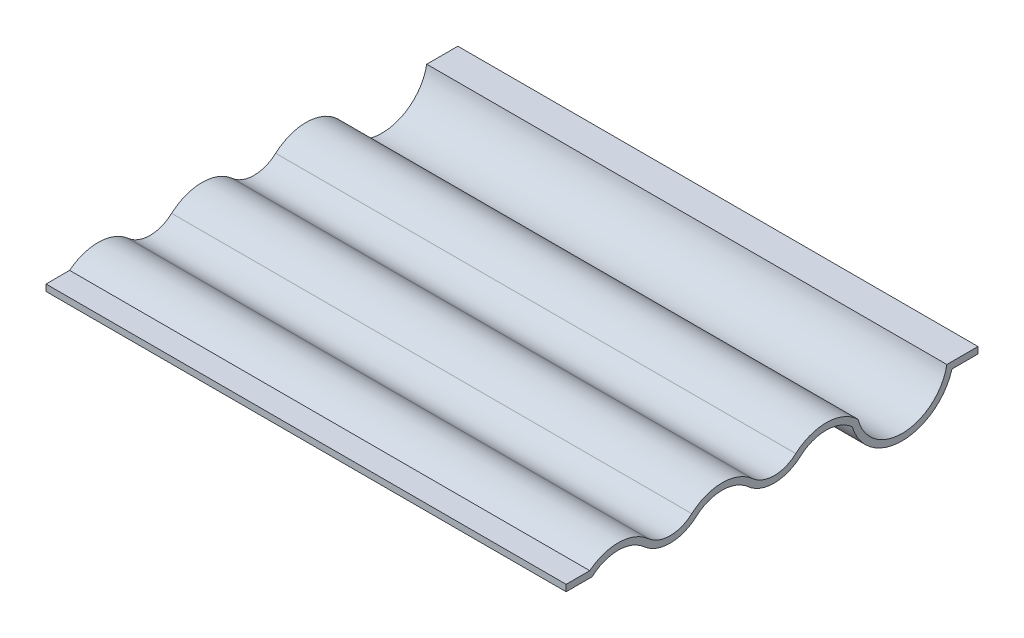
ISO-10303-21;
HEADER;
FILE_DESCRIPTION(('STEP AP214'),'2;1');
FILE_NAME('part.step','',(''),(''),'','','');
FILE_SCHEMA(('AUTOMOTIVE_DESIGN { 1 0 10303 214 1 1 1 1 }'));
ENDSEC;
DATA;
#1=APPLICATION_CONTEXT('core data for automotive mechanical design processes');
#2=APPLICATION_PROTOCOL_DEFINITION('international standard','automotive_design',2000,#1);
#3=PRODUCT_CONTEXT('',#1,'mechanical');
#4=PRODUCT('Part','Part','',(#3));
#5=PRODUCT_RELATED_PRODUCT_CATEGORY('part','',(#4));
#6=PRODUCT_DEFINITION_FORMATION('','',#4);
#7=PRODUCT_DEFINITION_CONTEXT('part definition',#1,'design');
#8=PRODUCT_DEFINITION('design','',#6,#7);
#9=PRODUCT_DEFINITION_SHAPE('','',#8);
#10=(LENGTH_UNIT() NAMED_UNIT(*) SI_UNIT(.MILLI.,.METRE.));
#11=(NAMED_UNIT(*) PLANE_ANGLE_UNIT() SI_UNIT($,.RADIAN.));
#12=(NAMED_UNIT(*) SI_UNIT($,.STERADIAN.) SOLID_ANGLE_UNIT());
#13=UNCERTAINTY_MEASURE_WITH_UNIT(LENGTH_MEASURE(1.E-05),#10,'distance_accuracy_value','');
#14=(GEOMETRIC_REPRESENTATION_CONTEXT(3) GLOBAL_UNCERTAINTY_ASSIGNED_CONTEXT((#13)) GLOBAL_UNIT_ASSIGNED_CONTEXT((#10,
#11,#12)) REPRESENTATION_CONTEXT('',''));
#15=CARTESIAN_POINT('',(0.,0.,0.));
#16=DIRECTION('',(0.,0.,1.));
#17=DIRECTION('',(1.,0.,0.));
#18=AXIS2_PLACEMENT_3D('',#15,#16,#17);
#19=CARTESIAN_POINT('',(254.,-14.1990316571236,64.1799405823263));
#20=DIRECTION('',(-1.,0.,0.));
#21=DIRECTION('',(0.,0.,1.));
#22=AXIS2_PLACEMENT_3D('',#19,#20,#21);
#23=CYLINDRICAL_SURFACE('',#22,19.05);
#24=CARTESIAN_POINT('',(0.,-14.1990316571236,64.1799405823263));
#25=DIRECTION('',(-1.,0.,0.));
#26=DIRECTION('',(0.,0.,1.));
#27=AXIS2_PLACEMENT_3D('',#24,#25,#26);
#28=CIRCLE('',#27,19.05);
#29=CARTESIAN_POINT('',(0.,0.,76.8799405823263));
#30=VERTEX_POINT('',#29);
#31=CARTESIAN_POINT('',(0.,0.,51.4799405823263));
#32=VERTEX_POINT('',#31);
#33=EDGE_CURVE('E199',#30,#32,#28,.T.);
#34=ORIENTED_EDGE('',*,*,#33,.T.);
#35=DIRECTION('',(-1.,0.,0.));
#36=VECTOR('',#35,1.);
#37=CARTESIAN_POINT('',(254.,0.,51.4799405823263));
#38=LINE('',#37,#36);
#39=CARTESIAN_POINT('',(254.,0.,51.4799405823263));
#40=VERTEX_POINT('',#39);
#41=EDGE_CURVE('E11',#40,#32,#38,.T.);
#42=ORIENTED_EDGE('',*,*,#41,.F.);
#43=CARTESIAN_POINT('',(254.,-14.1990316571236,64.1799405823263));
#44=DIRECTION('',(-1.,0.,0.));
#45=DIRECTION('',(0.,0.,1.));
#46=AXIS2_PLACEMENT_3D('',#43,#44,#45);
#47=CIRCLE('',#46,19.05);
#48=CARTESIAN_POINT('',(254.,0.,76.8799405823263));
#49=VERTEX_POINT('',#48);
#50=EDGE_CURVE('E251',#49,#40,#47,.T.);
#51=ORIENTED_EDGE('',*,*,#50,.F.);
#52=DIRECTION('',(-1.,0.,0.));
#53=VECTOR('',#52,1.);
#54=CARTESIAN_POINT('',(254.,0.,76.8799405823263));
#55=LINE('',#54,#53);
#56=EDGE_CURVE('E195',#49,#30,#55,.T.);
#57=ORIENTED_EDGE('',*,*,#56,.T.);
#58=EDGE_LOOP('',(#34,#42,#51,#57));
#59=FACE_BOUND('',#58,.T.);
#60=ADVANCED_FACE('F38',(#59),#23,.F.);
#61=CARTESIAN_POINT('',(254.,14.1990316571237,38.7799405823263));
#62=DIRECTION('',(-1.,0.,0.));
#63=DIRECTION('',(0.,0.,1.));
#64=AXIS2_PLACEMENT_3D('',#61,#62,#63);
#65=CYLINDRICAL_SURFACE('',#64,19.05);
#66=CARTESIAN_POINT('',(0.,14.1990316571237,38.7799405823263));
#67=DIRECTION('',(1.,0.,0.));
#68=DIRECTION('',(0.,0.,-1.));
#69=AXIS2_PLACEMENT_3D('',#66,#67,#68);
#70=CIRCLE('',#69,19.05);
#71=CARTESIAN_POINT('',(0.,0.,26.0799405823263));
#72=VERTEX_POINT('',#71);
#73=EDGE_CURVE('E203',#32,#72,#70,.T.);
#74=ORIENTED_EDGE('',*,*,#73,.T.);
#75=DIRECTION('',(-1.,0.,0.));
#76=VECTOR('',#75,1.);
#77=CARTESIAN_POINT('',(254.,0.,26.0799405823263));
#78=LINE('',#77,#76);
#79=CARTESIAN_POINT('',(254.,0.,26.0799405823263));
#80=VERTEX_POINT('',#79);
#81=EDGE_CURVE('E47',#80,#72,#78,.T.);
#82=ORIENTED_EDGE('',*,*,#81,.F.);
#83=CARTESIAN_POINT('',(254.,14.1990316571237,38.7799405823263));
#84=DIRECTION('',(1.,0.,0.));
#85=DIRECTION('',(0.,0.,-1.));
#86=AXIS2_PLACEMENT_3D('',#83,#84,#85);
#87=CIRCLE('',#86,19.05);
#88=EDGE_CURVE('E128',#40,#80,#87,.T.);
#89=ORIENTED_EDGE('',*,*,#88,.F.);
#90=ORIENTED_EDGE('',*,*,#41,.T.);
#91=EDGE_LOOP('',(#74,#82,#89,#90));
#92=FACE_BOUND('',#91,.T.);
#93=ADVANCED_FACE('F387',(#92),#65,.T.);
#94=CARTESIAN_POINT('',(254.,-14.1990316571236,13.3799405823263));
#95=DIRECTION('',(-1.,0.,0.));
#96=DIRECTION('',(0.,0.,1.));
#97=AXIS2_PLACEMENT_3D('',#94,#95,#96);
#98=CYLINDRICAL_SURFACE('',#97,19.05);
#99=CARTESIAN_POINT('',(0.,-14.1990316571236,13.3799405823263));
#100=DIRECTION('',(-1.,0.,0.));
#101=DIRECTION('',(0.,0.,1.));
#102=AXIS2_PLACEMENT_3D('',#99,#100,#101);
#103=CIRCLE('',#102,19.05);
#104=CARTESIAN_POINT('',(0.,0.,0.67994058232634));
#105=VERTEX_POINT('',#104);
#106=EDGE_CURVE('E206',#72,#105,#103,.T.);
#107=ORIENTED_EDGE('',*,*,#106,.T.);
#108=DIRECTION('',(-1.,0.,0.));
#109=VECTOR('',#108,1.);
#110=CARTESIAN_POINT('',(254.,0.,0.67994058232634));
#111=LINE('',#110,#109);
#112=CARTESIAN_POINT('',(254.,0.,0.67994058232634));
#113=VERTEX_POINT('',#112);
#114=EDGE_CURVE('E302',#113,#105,#111,.T.);
#115=ORIENTED_EDGE('',*,*,#114,.F.);
#116=CARTESIAN_POINT('',(254.,-14.1990316571236,13.3799405823263));
#117=DIRECTION('',(-1.,0.,0.));
#118=DIRECTION('',(0.,0.,1.));
#119=AXIS2_PLACEMENT_3D('',#116,#117,#118);
#120=CIRCLE('',#119,19.05);
#121=EDGE_CURVE('E312',#80,#113,#120,.T.);
#122=ORIENTED_EDGE('',*,*,#121,.F.);
#123=ORIENTED_EDGE('',*,*,#81,.T.);
#124=EDGE_LOOP('',(#107,#115,#122,#123));
#125=FACE_BOUND('',#124,.T.);
#126=ADVANCED_FACE('F310',(#125),#98,.F.);
#127=CARTESIAN_POINT('',(254.,14.1990316571237,-12.0200594176737));
#128=DIRECTION('',(-1.,0.,0.));
#129=DIRECTION('',(0.,0.,1.));
#130=AXIS2_PLACEMENT_3D('',#127,#128,#129);
#131=CYLINDRICAL_SURFACE('',#130,19.05);
#132=CARTESIAN_POINT('',(0.,14.1990316571237,-12.0200594176737));
#133=DIRECTION('',(1.,0.,0.));
#134=DIRECTION('',(0.,0.,-1.));
#135=AXIS2_PLACEMENT_3D('',#132,#133,#134);
#136=CIRCLE('',#135,19.05);
#137=CARTESIAN_POINT('',(0.,0.,-24.7200594176737));
#138=VERTEX_POINT('',#137);
#139=EDGE_CURVE('E209',#105,#138,#136,.T.);
#140=ORIENTED_EDGE('',*,*,#139,.T.);
#141=DIRECTION('',(-1.,0.,0.));
#142=VECTOR('',#141,1.);
#143=CARTESIAN_POINT('',(254.,0.,-24.7200594176737));
#144=LINE('',#143,#142);
#145=CARTESIAN_POINT('',(254.,0.,-24.7200594176737));
#146=VERTEX_POINT('',#145);
#147=EDGE_CURVE('E298',#146,#138,#144,.T.);
#148=ORIENTED_EDGE('',*,*,#147,.F.);
#149=CARTESIAN_POINT('',(254.,14.1990316571237,-12.0200594176737));
#150=DIRECTION('',(1.,0.,0.));
#151=DIRECTION('',(0.,0.,-1.));
#152=AXIS2_PLACEMENT_3D('',#149,#150,#151);
#153=CIRCLE('',#152,19.05);
#154=EDGE_CURVE('E331',#113,#146,#153,.T.);
#155=ORIENTED_EDGE('',*,*,#154,.F.);
#156=ORIENTED_EDGE('',*,*,#114,.T.);
#157=EDGE_LOOP('',(#140,#148,#155,#156));
#158=FACE_BOUND('',#157,.T.);
#159=ADVANCED_FACE('F321',(#158),#131,.T.);
#160=CARTESIAN_POINT('',(254.,-14.1990316571236,-37.4200594176737));
#161=DIRECTION('',(-1.,0.,0.));
#162=DIRECTION('',(0.,0.,1.));
#163=AXIS2_PLACEMENT_3D('',#160,#161,#162);
#164=CYLINDRICAL_SURFACE('',#163,19.05);
#165=CARTESIAN_POINT('',(0.,-14.1990316571236,-37.4200594176737));
#166=DIRECTION('',(-1.,0.,0.));
#167=DIRECTION('',(0.,0.,1.));
#168=AXIS2_PLACEMENT_3D('',#165,#166,#167);
#169=CIRCLE('',#168,19.05);
#170=CARTESIAN_POINT('',(0.,0.,-50.1200594176737));
#171=VERTEX_POINT('',#170);
#172=EDGE_CURVE('E212',#138,#171,#169,.T.);
#173=ORIENTED_EDGE('',*,*,#172,.T.);
#174=DIRECTION('',(-1.,0.,0.));
#175=VECTOR('',#174,1.);
#176=CARTESIAN_POINT('',(254.,0.,-50.1200594176737));
#177=LINE('',#176,#175);
#178=CARTESIAN_POINT('',(254.,0.,-50.1200594176737));
#179=VERTEX_POINT('',#178);
#180=EDGE_CURVE('E294',#179,#171,#177,.T.);
#181=ORIENTED_EDGE('',*,*,#180,.F.);
#182=CARTESIAN_POINT('',(254.,-14.1990316571236,-37.4200594176737));
#183=DIRECTION('',(-1.,0.,0.));
#184=DIRECTION('',(0.,0.,1.));
#185=AXIS2_PLACEMENT_3D('',#182,#183,#184);
#186=CIRCLE('',#185,19.05);
#187=EDGE_CURVE('E327',#146,#179,#186,.T.);
#188=ORIENTED_EDGE('',*,*,#187,.F.);
#189=ORIENTED_EDGE('',*,*,#147,.T.);
#190=EDGE_LOOP('',(#173,#181,#188,#189));
#191=FACE_BOUND('',#190,.T.);
#192=ADVANCED_FACE('F325',(#191),#164,.F.);
#193=CARTESIAN_POINT('',(254.,7.1491885783621,-74.4931819642621));
#194=DIRECTION('',(-1.,0.,0.));
#195=DIRECTION('',(0.,0.,1.));
#196=AXIS2_PLACEMENT_3D('',#193,#194,#195);
#197=CYLINDRICAL_SURFACE('',#196,25.4);
#198=CARTESIAN_POINT('',(0.,7.1491885783621,-74.4931819642621));
#199=DIRECTION('',(1.,0.,0.));
#200=DIRECTION('',(0.,0.,-1.));
#201=AXIS2_PLACEMENT_3D('',#198,#199,#200);
#202=CIRCLE('',#201,25.4);
#203=CARTESIAN_POINT('',(0.,0.,-98.8663045108505));
#204=VERTEX_POINT('',#203);
#205=EDGE_CURVE('E215',#171,#204,#202,.T.);
#206=ORIENTED_EDGE('',*,*,#205,.T.);
#207=DIRECTION('',(-1.,0.,0.));
#208=VECTOR('',#207,1.);
#209=CARTESIAN_POINT('',(254.,0.,-98.8663045108505));
#210=LINE('',#209,#208);
#211=CARTESIAN_POINT('',(254.,0.,-98.8663045108505));
#212=VERTEX_POINT('',#211);
#213=EDGE_CURVE('E290',#212,#204,#210,.T.);
#214=ORIENTED_EDGE('',*,*,#213,.F.);
#215=CARTESIAN_POINT('',(254.,7.1491885783621,-74.4931819642621));
#216=DIRECTION('',(1.,0.,0.));
#217=DIRECTION('',(0.,0.,-1.));
#218=AXIS2_PLACEMENT_3D('',#215,#216,#217);
#219=CIRCLE('',#218,25.4);
#220=EDGE_CURVE('E330',#179,#212,#219,.T.);
#221=ORIENTED_EDGE('',*,*,#220,.F.);
#222=ORIENTED_EDGE('',*,*,#180,.T.);
#223=EDGE_LOOP('',(#206,#214,#221,#222));
#224=FACE_BOUND('',#223,.T.);
#225=ADVANCED_FACE('F400',(#224),#197,.T.);
#226=CARTESIAN_POINT('',(254.,0.,-98.8663045108505));
#227=DIRECTION('',(0.,1.,0.));
#228=DIRECTION('',(0.,0.,1.));
#229=AXIS2_PLACEMENT_3D('',#226,#227,#228);
#230=PLANE('',#229);
#231=DIRECTION('',(0.,0.,-1.));
#232=VECTOR('',#231,1.);
#233=CARTESIAN_POINT('',(0.,0.,-98.8663045108505));
#234=LINE('',#233,#232);
#235=CARTESIAN_POINT('',(0.,0.,-111.566304510851));
#236=VERTEX_POINT('',#235);
#237=EDGE_CURVE('E218',#204,#236,#234,.T.);
#238=ORIENTED_EDGE('',*,*,#237,.T.);
#239=DIRECTION('',(-1.,0.,0.));
#240=VECTOR('',#239,1.);
#241=CARTESIAN_POINT('',(254.,0.,-111.566304510851));
#242=LINE('',#241,#240);
#243=CARTESIAN_POINT('',(254.,0.,-111.566304510851));
#244=VERTEX_POINT('',#243);
#245=EDGE_CURVE('E286',#244,#236,#242,.T.);
#246=ORIENTED_EDGE('',*,*,#245,.F.);
#247=DIRECTION('',(0.,0.,-1.));
#248=VECTOR('',#247,1.);
#249=CARTESIAN_POINT('',(254.,0.,-98.8663045108505));
#250=LINE('',#249,#248);
#251=EDGE_CURVE('E335',#212,#244,#250,.T.);
#252=ORIENTED_EDGE('',*,*,#251,.F.);
#253=ORIENTED_EDGE('',*,*,#213,.T.);
#254=EDGE_LOOP('',(#238,#246,#252,#253));
#255=FACE_BOUND('',#254,.T.);
#256=ADVANCED_FACE('F403',(#255),#230,.F.);
#257=CARTESIAN_POINT('',(254.,3.17500000000001,-111.566304510851));
#258=DIRECTION('',(0.,0.,1.));
#259=DIRECTION('',(1.,0.,0.));
#260=AXIS2_PLACEMENT_3D('',#257,#258,#259);
#261=PLANE('',#260);
#262=DIRECTION('',(0.,1.,0.));
#263=VECTOR('',#262,1.);
#264=CARTESIAN_POINT('',(0.,3.17500000000001,-111.566304510851));
#265=LINE('',#264,#263);
#266=CARTESIAN_POINT('',(0.,3.17500000000001,-111.566304510851));
#267=VERTEX_POINT('',#266);
#268=EDGE_CURVE('E221',#236,#267,#265,.T.);
#269=ORIENTED_EDGE('',*,*,#268,.T.);
#270=DIRECTION('',(-1.,0.,0.));
#271=VECTOR('',#270,1.);
#272=CARTESIAN_POINT('',(254.,3.17500000000001,-111.566304510851));
#273=LINE('',#272,#271);
#274=CARTESIAN_POINT('',(254.,3.17500000000001,-111.566304510851));
#275=VERTEX_POINT('',#274);
#276=EDGE_CURVE('E282',#275,#267,#273,.T.);
#277=ORIENTED_EDGE('',*,*,#276,.F.);
#278=DIRECTION('',(0.,1.,0.));
#279=VECTOR('',#278,1.);
#280=CARTESIAN_POINT('',(254.,3.17500000000001,-111.566304510851));
#281=LINE('',#280,#279);
#282=EDGE_CURVE('E342',#244,#275,#281,.T.);
#283=ORIENTED_EDGE('',*,*,#282,.F.);
#284=ORIENTED_EDGE('',*,*,#245,.T.);
#285=EDGE_LOOP('',(#269,#277,#283,#284));
#286=FACE_BOUND('',#285,.T.);
#287=ADVANCED_FACE('F407',(#286),#261,.F.);
#288=CARTESIAN_POINT('',(254.,3.17500000000001,-96.3599707121239));
#289=DIRECTION('',(0.,-1.,0.));
#290=DIRECTION('',(0.,0.,-1.));
#291=AXIS2_PLACEMENT_3D('',#288,#289,#290);
#292=PLANE('',#291);
#293=DIRECTION('',(0.,0.,1.));
#294=VECTOR('',#293,1.);
#295=CARTESIAN_POINT('',(0.,3.17500000000001,-96.3599707121239));
#296=LINE('',#295,#294);
#297=CARTESIAN_POINT('',(0.,3.175,-96.3599707121239));
#298=VERTEX_POINT('',#297);
#299=EDGE_CURVE('E224',#267,#298,#296,.T.);
#300=ORIENTED_EDGE('',*,*,#299,.T.);
#301=DIRECTION('',(-1.,0.,0.));
#302=VECTOR('',#301,1.);
#303=CARTESIAN_POINT('',(254.,3.175,-96.3599707121239));
#304=LINE('',#303,#302);
#305=CARTESIAN_POINT('',(254.,3.175,-96.3599707121239));
#306=VERTEX_POINT('',#305);
#307=EDGE_CURVE('E278',#306,#298,#304,.T.);
#308=ORIENTED_EDGE('',*,*,#307,.F.);
#309=DIRECTION('',(0.,0.,1.));
#310=VECTOR('',#309,1.);
#311=CARTESIAN_POINT('',(254.,3.17500000000001,-96.3599707121239));
#312=LINE('',#311,#310);
#313=EDGE_CURVE('E345',#275,#306,#312,.T.);
#314=ORIENTED_EDGE('',*,*,#313,.F.);
#315=ORIENTED_EDGE('',*,*,#276,.T.);
#316=EDGE_LOOP('',(#300,#308,#314,#315));
#317=FACE_BOUND('',#316,.T.);
#318=ADVANCED_FACE('F411',(#317),#292,.F.);
#319=CARTESIAN_POINT('',(254.,7.1491885783621,-74.4931819642621));
#320=DIRECTION('',(-1.,0.,0.));
#321=DIRECTION('',(0.,0.,1.));
#322=AXIS2_PLACEMENT_3D('',#319,#320,#321);
#323=CYLINDRICAL_SURFACE('',#322,22.225);
#324=CARTESIAN_POINT('',(0.,7.1491885783621,-74.4931819642621));
#325=DIRECTION('',(-1.,0.,0.));
#326=DIRECTION('',(0.,0.,-1.));
#327=AXIS2_PLACEMENT_3D('',#324,#325,#326);
#328=CIRCLE('',#327,22.225);
#329=CARTESIAN_POINT('',(0.,1.70414297239079,-52.945511478827));
#330=VERTEX_POINT('',#329);
#331=EDGE_CURVE('E227',#298,#330,#328,.T.);
#332=ORIENTED_EDGE('',*,*,#331,.T.);
#333=DIRECTION('',(-1.,0.,0.));
#334=VECTOR('',#333,1.);
#335=CARTESIAN_POINT('',(254.,1.70414297239079,-52.945511478827));
#336=LINE('',#335,#334);
#337=CARTESIAN_POINT('',(254.,1.70414297239079,-52.945511478827));
#338=VERTEX_POINT('',#337);
#339=EDGE_CURVE('E274',#338,#330,#336,.T.);
#340=ORIENTED_EDGE('',*,*,#339,.F.);
#341=CARTESIAN_POINT('',(254.,7.1491885783621,-74.4931819642621));
#342=DIRECTION('',(-1.,0.,0.));
#343=DIRECTION('',(0.,0.,-1.));
#344=AXIS2_PLACEMENT_3D('',#341,#342,#343);
#345=CIRCLE('',#344,22.225);
#346=EDGE_CURVE('E348',#306,#338,#345,.T.);
#347=ORIENTED_EDGE('',*,*,#346,.F.);
#348=ORIENTED_EDGE('',*,*,#307,.T.);
#349=EDGE_LOOP('',(#332,#340,#347,#348));
#350=FACE_BOUND('',#349,.T.);
#351=ADVANCED_FACE('F415',(#350),#323,.F.);
#352=CARTESIAN_POINT('',(254.,-14.1990316571236,-37.4200594176737));
#353=DIRECTION('',(-1.,0.,0.));
#354=DIRECTION('',(0.,0.,1.));
#355=AXIS2_PLACEMENT_3D('',#352,#353,#354);
#356=CYLINDRICAL_SURFACE('',#355,22.225);
#357=CARTESIAN_POINT('',(0.,-14.1990316571236,-37.4200594176737));
#358=DIRECTION('',(1.,0.,0.));
#359=DIRECTION('',(0.,0.,1.));
#360=AXIS2_PLACEMENT_3D('',#357,#358,#359);
#361=CIRCLE('',#360,22.225);
#362=CARTESIAN_POINT('',(0.,2.3665052761873,-22.603392751007));
#363=VERTEX_POINT('',#362);
#364=EDGE_CURVE('E230',#330,#363,#361,.T.);
#365=ORIENTED_EDGE('',*,*,#364,.T.);
#366=DIRECTION('',(-1.,0.,0.));
#367=VECTOR('',#366,1.);
#368=CARTESIAN_POINT('',(254.,2.3665052761873,-22.603392751007));
#369=LINE('',#368,#367);
#370=CARTESIAN_POINT('',(254.,2.3665052761873,-22.603392751007));
#371=VERTEX_POINT('',#370);
#372=EDGE_CURVE('E270',#371,#363,#369,.T.);
#373=ORIENTED_EDGE('',*,*,#372,.F.);
#374=CARTESIAN_POINT('',(254.,-14.1990316571236,-37.4200594176737));
#375=DIRECTION('',(1.,0.,0.));
#376=DIRECTION('',(0.,0.,1.));
#377=AXIS2_PLACEMENT_3D('',#374,#375,#376);
#378=CIRCLE('',#377,22.225);
#379=EDGE_CURVE('E351',#338,#371,#378,.T.);
#380=ORIENTED_EDGE('',*,*,#379,.F.);
#381=ORIENTED_EDGE('',*,*,#339,.T.);
#382=EDGE_LOOP('',(#365,#373,#380,#381));
#383=FACE_BOUND('',#382,.T.);
#384=ADVANCED_FACE('F419',(#383),#356,.T.);
#385=CARTESIAN_POINT('',(254.,14.1990316571237,-12.0200594176737));
#386=DIRECTION('',(-1.,0.,0.));
#387=DIRECTION('',(0.,0.,1.));
#388=AXIS2_PLACEMENT_3D('',#385,#386,#387);
#389=CYLINDRICAL_SURFACE('',#388,15.875);
#390=CARTESIAN_POINT('',(0.,14.1990316571237,-12.0200594176737));
#391=DIRECTION('',(-1.,0.,0.));
#392=DIRECTION('',(0.,0.,-1.));
#393=AXIS2_PLACEMENT_3D('',#390,#391,#392);
#394=CIRCLE('',#393,15.875);
#395=CARTESIAN_POINT('',(0.,2.36650527618731,-1.43672608434034));
#396=VERTEX_POINT('',#395);
#397=EDGE_CURVE('E233',#363,#396,#394,.T.);
#398=ORIENTED_EDGE('',*,*,#397,.T.);
#399=DIRECTION('',(-1.,0.,0.));
#400=VECTOR('',#399,1.);
#401=CARTESIAN_POINT('',(254.,2.36650527618731,-1.43672608434034));
#402=LINE('',#401,#400);
#403=CARTESIAN_POINT('',(254.,2.36650527618731,-1.43672608434034));
#404=VERTEX_POINT('',#403);
#405=EDGE_CURVE('E266',#404,#396,#402,.T.);
#406=ORIENTED_EDGE('',*,*,#405,.F.);
#407=CARTESIAN_POINT('',(254.,14.1990316571237,-12.0200594176737));
#408=DIRECTION('',(-1.,0.,0.));
#409=DIRECTION('',(0.,0.,-1.));
#410=AXIS2_PLACEMENT_3D('',#407,#408,#409);
#411=CIRCLE('',#410,15.875);
#412=EDGE_CURVE('E354',#371,#404,#411,.T.);
#413=ORIENTED_EDGE('',*,*,#412,.F.);
#414=ORIENTED_EDGE('',*,*,#372,.T.);
#415=EDGE_LOOP('',(#398,#406,#413,#414));
#416=FACE_BOUND('',#415,.T.);
#417=ADVANCED_FACE('F423',(#416),#389,.F.);
#418=CARTESIAN_POINT('',(254.,-14.1990316571236,13.3799405823263));
#419=DIRECTION('',(-1.,0.,0.));
#420=DIRECTION('',(0.,0.,1.));
#421=AXIS2_PLACEMENT_3D('',#418,#419,#420);
#422=CYLINDRICAL_SURFACE('',#421,22.225);
#423=CARTESIAN_POINT('',(0.,-14.1990316571236,13.3799405823263));
#424=DIRECTION('',(1.,0.,0.));
#425=DIRECTION('',(0.,0.,1.));
#426=AXIS2_PLACEMENT_3D('',#423,#424,#425);
#427=CIRCLE('',#426,22.225);
#428=CARTESIAN_POINT('',(0.,2.3665052761873,28.196607248993));
#429=VERTEX_POINT('',#428);
#430=EDGE_CURVE('E236',#396,#429,#427,.T.);
#431=ORIENTED_EDGE('',*,*,#430,.T.);
#432=DIRECTION('',(-1.,0.,0.));
#433=VECTOR('',#432,1.);
#434=CARTESIAN_POINT('',(254.,2.3665052761873,28.196607248993));
#435=LINE('',#434,#433);
#436=CARTESIAN_POINT('',(254.,2.3665052761873,28.196607248993));
#437=VERTEX_POINT('',#436);
#438=EDGE_CURVE('E262',#437,#429,#435,.T.);
#439=ORIENTED_EDGE('',*,*,#438,.F.);
#440=CARTESIAN_POINT('',(254.,-14.1990316571236,13.3799405823263));
#441=DIRECTION('',(1.,0.,0.));
#442=DIRECTION('',(0.,0.,1.));
#443=AXIS2_PLACEMENT_3D('',#440,#441,#442);
#444=CIRCLE('',#443,22.225);
#445=EDGE_CURVE('E357',#404,#437,#444,.T.);
#446=ORIENTED_EDGE('',*,*,#445,.F.);
#447=ORIENTED_EDGE('',*,*,#405,.T.);
#448=EDGE_LOOP('',(#431,#439,#446,#447));
#449=FACE_BOUND('',#448,.T.);
#450=ADVANCED_FACE('F427',(#449),#422,.T.);
#451=CARTESIAN_POINT('',(254.,14.1990316571237,38.7799405823263));
#452=DIRECTION('',(-1.,0.,0.));
#453=DIRECTION('',(0.,0.,1.));
#454=AXIS2_PLACEMENT_3D('',#451,#452,#453);
#455=CYLINDRICAL_SURFACE('',#454,15.875);
#456=CARTESIAN_POINT('',(0.,14.1990316571237,38.7799405823263));
#457=DIRECTION('',(-1.,0.,0.));
#458=DIRECTION('',(0.,0.,-1.));
#459=AXIS2_PLACEMENT_3D('',#456,#457,#458);
#460=CIRCLE('',#459,15.875);
#461=CARTESIAN_POINT('',(0.,2.36650527618731,49.3632739156597));
#462=VERTEX_POINT('',#461);
#463=EDGE_CURVE('E239',#429,#462,#460,.T.);
#464=ORIENTED_EDGE('',*,*,#463,.T.);
#465=DIRECTION('',(-1.,0.,0.));
#466=VECTOR('',#465,1.);
#467=CARTESIAN_POINT('',(254.,2.36650527618731,49.3632739156597));
#468=LINE('',#467,#466);
#469=CARTESIAN_POINT('',(254.,2.36650527618731,49.3632739156597));
#470=VERTEX_POINT('',#469);
#471=EDGE_CURVE('E258',#470,#462,#468,.T.);
#472=ORIENTED_EDGE('',*,*,#471,.F.);
#473=CARTESIAN_POINT('',(254.,14.1990316571237,38.7799405823263));
#474=DIRECTION('',(-1.,0.,0.));
#475=DIRECTION('',(0.,0.,-1.));
#476=AXIS2_PLACEMENT_3D('',#473,#474,#475);
#477=CIRCLE('',#476,15.875);
#478=EDGE_CURVE('E360',#437,#470,#477,.T.);
#479=ORIENTED_EDGE('',*,*,#478,.F.);
#480=ORIENTED_EDGE('',*,*,#438,.T.);
#481=EDGE_LOOP('',(#464,#472,#479,#480));
#482=FACE_BOUND('',#481,.T.);
#483=ADVANCED_FACE('F368',(#482),#455,.F.);
#484=CARTESIAN_POINT('',(254.,-14.1990316571236,64.1799405823263));
#485=DIRECTION('',(-1.,0.,0.));
#486=DIRECTION('',(0.,0.,1.));
#487=AXIS2_PLACEMENT_3D('',#484,#485,#486);
#488=CYLINDRICAL_SURFACE('',#487,22.225);
#489=CARTESIAN_POINT('',(0.,-14.1990316571236,64.1799405823263));
#490=DIRECTION('',(1.,0.,0.));
#491=DIRECTION('',(0.,0.,1.));
#492=AXIS2_PLACEMENT_3D('',#489,#490,#491);
#493=CIRCLE('',#492,22.225);
#494=CARTESIAN_POINT('',(0.,3.17500000000002,78.0397258973038));
#495=VERTEX_POINT('',#494);
#496=EDGE_CURVE('E242',#462,#495,#493,.T.);
#497=ORIENTED_EDGE('',*,*,#496,.T.);
#498=DIRECTION('',(-1.,0.,0.));
#499=VECTOR('',#498,1.);
#500=CARTESIAN_POINT('',(254.,3.17500000000002,78.0397258973038));
#501=LINE('',#500,#499);
#502=CARTESIAN_POINT('',(254.,3.17500000000002,78.0397258973038));
#503=VERTEX_POINT('',#502);
#504=EDGE_CURVE('E188',#503,#495,#501,.T.);
#505=ORIENTED_EDGE('',*,*,#504,.F.);
#506=CARTESIAN_POINT('',(254.,-14.1990316571236,64.1799405823263));
#507=DIRECTION('',(1.,0.,0.));
#508=DIRECTION('',(0.,0.,1.));
#509=AXIS2_PLACEMENT_3D('',#506,#507,#508);
#510=CIRCLE('',#509,22.225);
#511=EDGE_CURVE('E177',#470,#503,#510,.T.);
#512=ORIENTED_EDGE('',*,*,#511,.F.);
#513=ORIENTED_EDGE('',*,*,#471,.T.);
#514=EDGE_LOOP('',(#497,#505,#512,#513));
#515=FACE_BOUND('',#514,.T.);
#516=ADVANCED_FACE('F372',(#515),#488,.T.);
#517=CARTESIAN_POINT('',(254.,3.17500000000002,78.0397258973038));
#518=DIRECTION('',(0.,-1.,0.));
#519=DIRECTION('',(0.,0.,-1.));
#520=AXIS2_PLACEMENT_3D('',#517,#518,#519);
#521=PLANE('',#520);
#522=DIRECTION('',(0.,0.,1.));
#523=VECTOR('',#522,1.);
#524=CARTESIAN_POINT('',(0.,3.17500000000002,78.0397258973038));
#525=LINE('',#524,#523);
#526=CARTESIAN_POINT('',(0.,3.17500000000001,89.5638315647687));
#527=VERTEX_POINT('',#526);
#528=EDGE_CURVE('E186',#495,#527,#525,.T.);
#529=ORIENTED_EDGE('',*,*,#528,.T.);
#530=DIRECTION('',(-1.,0.,0.));
#531=VECTOR('',#530,1.);
#532=CARTESIAN_POINT('',(254.,3.17500000000001,89.5638315647687));
#533=LINE('',#532,#531);
#534=CARTESIAN_POINT('',(254.,3.17500000000001,89.5638315647687));
#535=VERTEX_POINT('',#534);
#536=EDGE_CURVE('E183',#535,#527,#533,.T.);
#537=ORIENTED_EDGE('',*,*,#536,.F.);
#538=DIRECTION('',(0.,0.,1.));
#539=VECTOR('',#538,1.);
#540=CARTESIAN_POINT('',(254.,3.17500000000002,78.0397258973038));
#541=LINE('',#540,#539);
#542=EDGE_CURVE('E171',#503,#535,#541,.T.);
#543=ORIENTED_EDGE('',*,*,#542,.F.);
#544=ORIENTED_EDGE('',*,*,#504,.T.);
#545=EDGE_LOOP('',(#529,#537,#543,#544));
#546=FACE_BOUND('',#545,.T.);
#547=ADVANCED_FACE('F184',(#546),#521,.F.);
#548=CARTESIAN_POINT('',(254.,3.17500000000001,89.5638315647687));
#549=DIRECTION('',(0.,0.,-1.));
#550=DIRECTION('',(-1.,0.,0.));
#551=AXIS2_PLACEMENT_3D('',#548,#549,#550);
#552=PLANE('',#551);
#553=DIRECTION('',(0.,-1.,0.));
#554=VECTOR('',#553,1.);
#555=CARTESIAN_POINT('',(0.,3.17500000000001,89.5638315647687));
#556=LINE('',#555,#554);
#557=CARTESIAN_POINT('',(0.,0.,89.5638315647687));
#558=VERTEX_POINT('',#557);
#559=EDGE_CURVE('E114',#527,#558,#556,.T.);
#560=ORIENTED_EDGE('',*,*,#559,.T.);
#561=DIRECTION('',(-1.,0.,0.));
#562=VECTOR('',#561,1.);
#563=CARTESIAN_POINT('',(254.,0.,89.5638315647687));
#564=LINE('',#563,#562);
#565=CARTESIAN_POINT('',(254.,0.,89.5638315647687));
#566=VERTEX_POINT('',#565);
#567=EDGE_CURVE('E189',#566,#558,#564,.T.);
#568=ORIENTED_EDGE('',*,*,#567,.F.);
#569=DIRECTION('',(0.,-1.,0.));
#570=VECTOR('',#569,1.);
#571=CARTESIAN_POINT('',(254.,3.17500000000001,89.5638315647687));
#572=LINE('',#571,#570);
#573=EDGE_CURVE('E175',#535,#566,#572,.T.);
#574=ORIENTED_EDGE('',*,*,#573,.F.);
#575=ORIENTED_EDGE('',*,*,#536,.T.);
#576=EDGE_LOOP('',(#560,#568,#574,#575));
#577=FACE_BOUND('',#576,.T.);
#578=ADVANCED_FACE('F191',(#577),#552,.F.);
#579=CARTESIAN_POINT('',(254.,0.,76.8799405823263));
#580=DIRECTION('',(0.,1.,0.));
#581=DIRECTION('',(0.,0.,1.));
#582=AXIS2_PLACEMENT_3D('',#579,#580,#581);
#583=PLANE('',#582);
#584=DIRECTION('',(0.,0.,-1.));
#585=VECTOR('',#584,1.);
#586=CARTESIAN_POINT('',(0.,0.,76.8799405823263));
#587=LINE('',#586,#585);
#588=EDGE_CURVE('E120',#558,#30,#587,.T.);
#589=ORIENTED_EDGE('',*,*,#588,.T.);
#590=ORIENTED_EDGE('',*,*,#56,.F.);
#591=DIRECTION('',(0.,0.,-1.));
#592=VECTOR('',#591,1.);
#593=CARTESIAN_POINT('',(254.,0.,76.8799405823263));
#594=LINE('',#593,#592);
#595=EDGE_CURVE('E55',#566,#49,#594,.T.);
#596=ORIENTED_EDGE('',*,*,#595,.F.);
#597=ORIENTED_EDGE('',*,*,#567,.T.);
#598=EDGE_LOOP('',(#589,#590,#596,#597));
#599=FACE_BOUND('',#598,.T.);
#600=ADVANCED_FACE('F376',(#599),#583,.F.);
#601=CARTESIAN_POINT('',(254.,-14.1990316571236,64.1799405823263));
#602=DIRECTION('',(-1.,0.,0.));
#603=DIRECTION('',(0.,0.,1.));
#604=AXIS2_PLACEMENT_3D('',#601,#602,#603);
#605=PLANE('',#604);
#606=ORIENTED_EDGE('',*,*,#50,.T.);
#607=ORIENTED_EDGE('',*,*,#88,.T.);
#608=ORIENTED_EDGE('',*,*,#121,.T.);
#609=ORIENTED_EDGE('',*,*,#154,.T.);
#610=ORIENTED_EDGE('',*,*,#187,.T.);
#611=ORIENTED_EDGE('',*,*,#220,.T.);
#612=ORIENTED_EDGE('',*,*,#251,.T.);
#613=ORIENTED_EDGE('',*,*,#282,.T.);
#614=ORIENTED_EDGE('',*,*,#313,.T.);
#615=ORIENTED_EDGE('',*,*,#346,.T.);
#616=ORIENTED_EDGE('',*,*,#379,.T.);
#617=ORIENTED_EDGE('',*,*,#412,.T.);
#618=ORIENTED_EDGE('',*,*,#445,.T.);
#619=ORIENTED_EDGE('',*,*,#478,.T.);
#620=ORIENTED_EDGE('',*,*,#511,.T.);
#621=ORIENTED_EDGE('',*,*,#542,.T.);
#622=ORIENTED_EDGE('',*,*,#573,.T.);
#623=ORIENTED_EDGE('',*,*,#595,.T.);
#624=EDGE_LOOP('',(#606,#607,#608,#609,#610,#611,#612,#613,#614,#615,#616,#617,#618,#619,#620,
#621,#622,#623));
#625=FACE_BOUND('',#624,.T.);
#626=ADVANCED_FACE('F173',(#625),#605,.F.);
#627=CARTESIAN_POINT('',(0.,-14.1990316571236,64.1799405823263));
#628=DIRECTION('',(-1.,0.,0.));
#629=DIRECTION('',(0.,0.,1.));
#630=AXIS2_PLACEMENT_3D('',#627,#628,#629);
#631=PLANE('',#630);
#632=ORIENTED_EDGE('',*,*,#33,.F.);
#633=ORIENTED_EDGE('',*,*,#588,.F.);
#634=ORIENTED_EDGE('',*,*,#559,.F.);
#635=ORIENTED_EDGE('',*,*,#528,.F.);
#636=ORIENTED_EDGE('',*,*,#496,.F.);
#637=ORIENTED_EDGE('',*,*,#463,.F.);
#638=ORIENTED_EDGE('',*,*,#430,.F.);
#639=ORIENTED_EDGE('',*,*,#397,.F.);
#640=ORIENTED_EDGE('',*,*,#364,.F.);
#641=ORIENTED_EDGE('',*,*,#331,.F.);
#642=ORIENTED_EDGE('',*,*,#299,.F.);
#643=ORIENTED_EDGE('',*,*,#268,.F.);
#644=ORIENTED_EDGE('',*,*,#237,.F.);
#645=ORIENTED_EDGE('',*,*,#205,.F.);
#646=ORIENTED_EDGE('',*,*,#172,.F.);
#647=ORIENTED_EDGE('',*,*,#139,.F.);
#648=ORIENTED_EDGE('',*,*,#106,.F.);
#649=ORIENTED_EDGE('',*,*,#73,.F.);
#650=EDGE_LOOP('',(#632,#633,#634,#635,#636,#637,#638,#639,#640,#641,#642,#643,#644,#645,#646,
#647,#648,#649));
#651=FACE_BOUND('',#650,.T.);
#652=ADVANCED_FACE('F316',(#651),#631,.T.);
#653=CLOSED_SHELL('',(#60,#93,#126,#159,#192,#225,#256,#287,#318,#351,#384,#417,#450,#483,#516,
#547,#578,#600,#626,#652));
#654=MANIFOLD_SOLID_BREP('B2',#653);
#655=ADVANCED_BREP_SHAPE_REPRESENTATION('',(#18,#654),#14);
#656=SHAPE_DEFINITION_REPRESENTATION(#9,#655);
ENDSEC;
END-ISO-10303-21;
